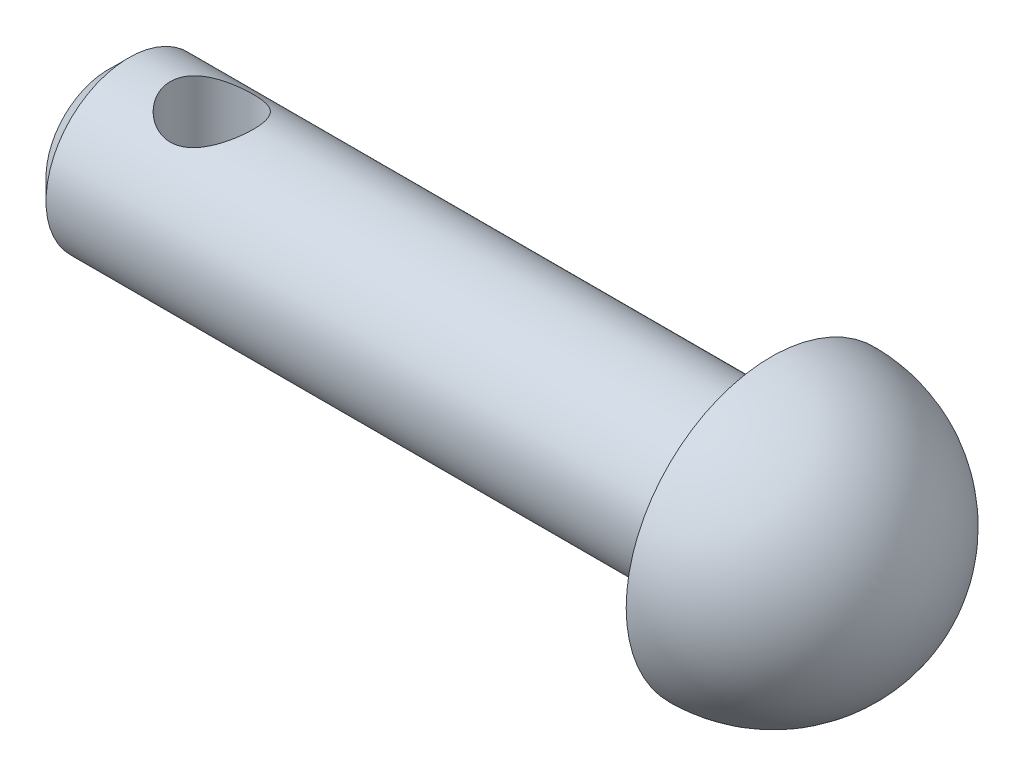
ISO-10303-21;
HEADER;
FILE_DESCRIPTION(('STEP AP214'),'2;1');
FILE_NAME('part.step','',(''),(''),'','','');
FILE_SCHEMA(('AUTOMOTIVE_DESIGN { 1 0 10303 214 1 1 1 1 }'));
ENDSEC;
DATA;
#1=APPLICATION_CONTEXT('core data for automotive mechanical design processes');
#2=APPLICATION_PROTOCOL_DEFINITION('international standard','automotive_design',2000,#1);
#3=PRODUCT_CONTEXT('',#1,'mechanical');
#4=PRODUCT('Part','Part','',(#3));
#5=PRODUCT_RELATED_PRODUCT_CATEGORY('part','',(#4));
#6=PRODUCT_DEFINITION_FORMATION('','',#4);
#7=PRODUCT_DEFINITION_CONTEXT('part definition',#1,'design');
#8=PRODUCT_DEFINITION('design','',#6,#7);
#9=PRODUCT_DEFINITION_SHAPE('','',#8);
#10=(LENGTH_UNIT() NAMED_UNIT(*) SI_UNIT(.MILLI.,.METRE.));
#11=(NAMED_UNIT(*) PLANE_ANGLE_UNIT() SI_UNIT($,.RADIAN.));
#12=(NAMED_UNIT(*) SI_UNIT($,.STERADIAN.) SOLID_ANGLE_UNIT());
#13=UNCERTAINTY_MEASURE_WITH_UNIT(LENGTH_MEASURE(1.E-05),#10,'distance_accuracy_value','');
#14=(GEOMETRIC_REPRESENTATION_CONTEXT(3) GLOBAL_UNCERTAINTY_ASSIGNED_CONTEXT((#13)) GLOBAL_UNIT_ASSIGNED_CONTEXT((#10,
#11,#12)) REPRESENTATION_CONTEXT('',''));
#15=CARTESIAN_POINT('',(0.,0.,0.));
#16=DIRECTION('',(0.,0.,1.));
#17=DIRECTION('',(1.,0.,0.));
#18=AXIS2_PLACEMENT_3D('',#15,#16,#17);
#19=CARTESIAN_POINT('',(-16.,0.,0.));
#20=DIRECTION('',(1.,0.,0.));
#21=DIRECTION('',(0.,0.,-1.));
#22=AXIS2_PLACEMENT_3D('',#19,#20,#21);
#23=CYLINDRICAL_SURFACE('',#22,2.);
#24=CARTESIAN_POINT('',(-15.5,0.,0.));
#25=DIRECTION('',(1.,0.,0.));
#26=DIRECTION('',(0.,0.,-1.));
#27=AXIS2_PLACEMENT_3D('',#24,#25,#26);
#28=CIRCLE('',#27,2.);
#29=CARTESIAN_POINT('',(-15.5,0.,-2.));
#30=VERTEX_POINT('',#29);
#31=EDGE_CURVE('E39',#30,#30,#28,.T.);
#32=ORIENTED_EDGE('',*,*,#31,.T.);
#33=EDGE_LOOP('',(#32));
#34=FACE_BOUND('',#33,.T.);
#35=CARTESIAN_POINT('',(-12.5,-2.,0.));
#36=CARTESIAN_POINT('',(-12.5000033023195,-1.99999713404151,0.0525719629529865));
#37=CARTESIAN_POINT('',(-12.5041700731217,-1.99790491019518,0.105206599698033));
#38=CARTESIAN_POINT('',(-12.5206528803409,-1.98974156037396,0.208920235268425));
#39=CARTESIAN_POINT('',(-12.5329843929976,-1.98366287828984,0.259996086713504));
#40=CARTESIAN_POINT('',(-12.5651938086168,-1.96816279403312,0.358933544880574));
#41=CARTESIAN_POINT('',(-12.585042384248,-1.9587543917752,0.40680680293918));
#42=CARTESIAN_POINT('',(-12.6315706213649,-1.93745776515779,0.498472616806565));
#43=CARTESIAN_POINT('',(-12.6582497442489,-1.9255697363353,0.54226549399005));
#44=CARTESIAN_POINT('',(-12.7195172494853,-1.89956258258057,0.627507817761919));
#45=CARTESIAN_POINT('',(-12.7544864792396,-1.88535199127536,0.668655211122112));
#46=CARTESIAN_POINT('',(-12.830521479247,-1.85659970246744,0.744779444866977));
#47=CARTESIAN_POINT('',(-12.8715918517724,-1.84205776209035,0.779751583106766));
#48=CARTESIAN_POINT('',(-12.9624833495234,-1.81298951197347,0.845252000450278));
#49=CARTESIAN_POINT('',(-13.0127360983459,-1.79855186970132,0.875225335551636));
#50=CARTESIAN_POINT('',(-13.1183673359862,-1.77285978772321,0.926168226890694));
#51=CARTESIAN_POINT('',(-13.1737421287227,-1.7616030760699,0.947144214966333));
#52=CARTESIAN_POINT('',(-13.2846651054219,-1.74457867037809,0.978132442188588));
#53=CARTESIAN_POINT('',(-13.3400044520674,-1.73852271583714,0.988725857080441));
#54=CARTESIAN_POINT('',(-13.4519788377795,-1.73181889948528,1.00042699330885));
#55=CARTESIAN_POINT('',(-13.5086125408712,-1.73116569343288,1.00154408837307));
#56=CARTESIAN_POINT('',(-13.6142860243154,-1.73510930257248,0.994687287172294));
#57=CARTESIAN_POINT('',(-13.6634240312231,-1.73908763662014,0.987784559536821));
#58=CARTESIAN_POINT('',(-13.759721909373,-1.7507622873385,0.966939849056931));
#59=CARTESIAN_POINT('',(-13.8068811453053,-1.75845978831776,0.952995623897651));
#60=CARTESIAN_POINT('',(-13.8992291325657,-1.77687476412741,0.918209780386003));
#61=CARTESIAN_POINT('',(-13.9443463987858,-1.78765840663999,0.897215067115994));
#62=CARTESIAN_POINT('',(-14.03063429259,-1.81103404281404,0.849041687668002));
#63=CARTESIAN_POINT('',(-14.0718031356001,-1.82362684780191,0.821860243812467));
#64=CARTESIAN_POINT('',(-14.1545212527432,-1.85113157903286,0.758066054912788));
#65=CARTESIAN_POINT('',(-14.1954568735762,-1.86613510236746,0.720694458369282));
#66=CARTESIAN_POINT('',(-14.2707354185909,-1.89547623300407,0.639555578741374));
#67=CARTESIAN_POINT('',(-14.3050751920339,-1.90981351958801,0.595785256574286));
#68=CARTESIAN_POINT('',(-14.3676856610297,-1.93701987282964,0.500516505831849));
#69=CARTESIAN_POINT('',(-14.3956004724457,-1.94978984162007,0.44875359159941));
#70=CARTESIAN_POINT('',(-14.442097029043,-1.97157881121242,0.340466215488798));
#71=CARTESIAN_POINT('',(-14.4606861850152,-1.98060078943553,0.283945576265277));
#72=CARTESIAN_POINT('',(-14.4864754037167,-1.99324333741436,0.172766491660702));
#73=CARTESIAN_POINT('',(-14.4944912357468,-1.99724938301312,0.118341530548324));
#74=CARTESIAN_POINT('',(-14.5014647311345,-2.00073013459102,0.00877959994935364));
#75=CARTESIAN_POINT('',(-14.5004266856395,-2.00020698721312,-0.0463570198699015));
#76=CARTESIAN_POINT('',(-14.4897933115812,-1.99491192253441,-0.151232971985994));
#77=CARTESIAN_POINT('',(-14.48086746727,-1.9904724568819,-0.201059408049954));
#78=CARTESIAN_POINT('',(-14.4557619281049,-1.97822171314819,-0.298406892301917));
#79=CARTESIAN_POINT('',(-14.4395814335466,-1.97041006334332,-0.345927685690997));
#80=CARTESIAN_POINT('',(-14.4000015335668,-1.95184251413669,-0.438888608449665));
#81=CARTESIAN_POINT('',(-14.3764089498832,-1.94100881769939,-0.484230397006154));
#82=CARTESIAN_POINT('',(-14.322892464354,-1.91743974317109,-0.570461361698921));
#83=CARTESIAN_POINT('',(-14.2929658654066,-1.90470355565785,-0.611348629775282));
#84=CARTESIAN_POINT('',(-14.2242395746671,-1.87708221337464,-0.691767689290652));
#85=CARTESIAN_POINT('',(-14.1848571315464,-1.86210884848441,-0.730772077824638));
#86=CARTESIAN_POINT('',(-14.1000748487307,-1.83262391603874,-0.801856321113238));
#87=CARTESIAN_POINT('',(-14.0546708811836,-1.81811267381526,-0.83393138569084));
#88=CARTESIAN_POINT('',(-13.9563563457997,-1.79051192226068,-0.891707914497695));
#89=CARTESIAN_POINT('',(-13.9031887337914,-1.77752529663472,-0.917025495878637));
#90=CARTESIAN_POINT('',(-13.7924899323075,-1.75574072368126,-0.958082826013803));
#91=CARTESIAN_POINT('',(-13.7349644734988,-1.74693738240618,-0.97383491588757));
#92=CARTESIAN_POINT('',(-13.6230897771385,-1.73561501008667,-0.993861687449679));
#93=CARTESIAN_POINT('',(-13.568965746571,-1.73257383460491,-0.999092996400864));
#94=CARTESIAN_POINT('',(-13.4605529328293,-1.73165354646175,-1.00068915438079));
#95=CARTESIAN_POINT('',(-13.4062642312606,-1.73377219627553,-0.997057846624398));
#96=CARTESIAN_POINT('',(-13.304516498468,-1.74237862050025,-0.981926125592262));
#97=CARTESIAN_POINT('',(-13.2568995298556,-1.74843094482394,-0.971208314342799));
#98=CARTESIAN_POINT('',(-13.1641918805753,-1.76371016187918,-0.943175358224645));
#99=CARTESIAN_POINT('',(-13.119102017908,-1.77293807569676,-0.92585809115981));
#100=CARTESIAN_POINT('',(-13.0293751490134,-1.79428530364528,-0.883815745300682));
#101=CARTESIAN_POINT('',(-12.9849720981703,-1.80655722396191,-0.858671137816458));
#102=CARTESIAN_POINT('',(-12.9007254638194,-1.8323533163459,-0.802150971636634));
#103=CARTESIAN_POINT('',(-12.8608842694815,-1.84587813794522,-0.770772171238648));
#104=CARTESIAN_POINT('',(-12.7818580176424,-1.87462323159313,-0.698203326664641));
#105=CARTESIAN_POINT('',(-12.7433408976381,-1.88984983311469,-0.656284423010171));
#106=CARTESIAN_POINT('',(-12.6737370165764,-1.91877752255088,-0.566154806220279));
#107=CARTESIAN_POINT('',(-12.6426542605737,-1.9324777860804,-0.517940723256785));
#108=CARTESIAN_POINT('',(-12.5887636372378,-1.95698009585103,-0.415931596819947));
#109=CARTESIAN_POINT('',(-12.5660158305886,-1.96776096562909,-0.362099503934614));
#110=CARTESIAN_POINT('',(-12.530191832081,-1.98501341363465,-0.250742101294191));
#111=CARTESIAN_POINT('',(-12.5170881531704,-1.99149723372932,-0.193227799623166));
#112=CARTESIAN_POINT('',(-12.5061025889242,-1.99695461909663,-0.112601946483383));
#113=CARTESIAN_POINT('',(-12.5038173591364,-1.99809365339202,-0.0901618794394981));
#114=CARTESIAN_POINT('',(-12.5007653344832,-1.99961696977865,-0.0451517318071573));
#115=CARTESIAN_POINT('',(-12.4999985815288,-2.00000123103763,-0.0225816476473812));
#116=CARTESIAN_POINT('',(-12.5,-2.,0.));
#117=B_SPLINE_CURVE_WITH_KNOTS('',3,(#35,#36,#37,#38,#39,#40,#41,#42,#43,#44,#45,#46,#47,#48,
#49,#50,#51,#52,#53,#54,#55,#56,#57,#58,#59,#60,#61,#62,#63,#64,#65,#66,#67,#68,#69,#70,#71,#72,
#73,#74,#75,#76,#77,#78,#79,#80,#81,#82,#83,#84,#85,#86,#87,#88,#89,#90,#91,#92,#93,#94,#95,#96,
#97,#98,#99,#100,#101,#102,#103,#104,#105,#106,#107,#108,#109,#110,#111,#112,#113,#114,#115,
#116),.UNSPECIFIED.,.T.,.F.,(4,2,2,2,2,2,2,2,2,2,2,2,2,2,2,2,2,2,2,2,2,2,2,2,2,2,2,2,2,2,2,2,2,
2,2,2,2,2,2,2,4),(0.,0.157624257420292,0.315548149709197,0.472862155492299,0.630163760581567,
0.796981758718089,0.963926237654035,1.14381726430752,1.32357947898281,1.4925801214023,
1.6614135732902,1.81005712409321,1.95874803925679,2.11090240168487,2.26312521260222,
2.43464941333878,2.60625534598686,2.7858302221444,2.96526216912279,3.12983290471345,
3.29432564511476,3.44606906506122,3.59782921630931,3.75392856027898,3.91009450748339,
4.08159610644418,4.25321588615432,4.43314682159674,4.61284511940777,4.77529307498373,
4.93767059860005,5.08457930244182,5.23153528783678,5.38836456775614,5.54527561138957,
5.72125242752498,5.89732383376572,6.07464013662925,6.2514490862493,6.31915280137697,
6.38685838514846),.UNSPECIFIED.);
#118=CARTESIAN_POINT('',(-12.5,-2.,0.));
#119=VERTEX_POINT('',#118);
#120=EDGE_CURVE('E64',#119,#119,#117,.T.);
#121=ORIENTED_EDGE('',*,*,#120,.F.);
#122=EDGE_LOOP('',(#121));
#123=FACE_BOUND('',#122,.T.);
#124=CARTESIAN_POINT('',(-13.5,1.73205080756888,1.));
#125=CARTESIAN_POINT('',(-13.4478921918048,1.73205534728459,0.999996363074531));
#126=CARTESIAN_POINT('',(-13.395718588475,1.73443801187756,0.995899970733216));
#127=CARTESIAN_POINT('',(-13.2929727353228,1.74362366452052,0.979723209898053));
#128=CARTESIAN_POINT('',(-13.2424040849566,1.75043594055559,0.967626064554179));
#129=CARTESIAN_POINT('',(-13.1445483356561,1.76749346605398,0.936099948699812));
#130=CARTESIAN_POINT('',(-13.0972453475264,1.77772043473252,0.916709952493731));
#131=CARTESIAN_POINT('',(-13.0065757980033,1.80042664816858,0.871267525376372));
#132=CARTESIAN_POINT('',(-12.9632094497375,1.81290601476065,0.845214734035773));
#133=CARTESIAN_POINT('',(-12.8776942714425,1.83996869057441,0.784666540530878));
#134=CARTESIAN_POINT('',(-12.8359408643265,1.85464063637954,0.74965203614377));
#135=CARTESIAN_POINT('',(-12.7585916115933,1.88371982785706,0.673253807614468));
#136=CARTESIAN_POINT('',(-12.7229988374165,1.8981269383125,0.631866925782293));
#137=CARTESIAN_POINT('',(-12.6566328488523,1.92621476952949,0.540489563414546));
#138=CARTESIAN_POINT('',(-12.6263462321405,1.93978106418172,0.490107189012574));
#139=CARTESIAN_POINT('',(-12.5748591467542,1.96350756099529,0.384157026599503));
#140=CARTESIAN_POINT('',(-12.5536529438628,1.97366991183742,0.328592538138155));
#141=CARTESIAN_POINT('',(-12.5224953386989,1.98880461244237,0.218044943925977));
#142=CARTESIAN_POINT('',(-12.5118504736445,1.99409480220892,0.163301790488817));
#143=CARTESIAN_POINT('',(-12.499833881325,2.00007583846067,0.0525706286978483));
#144=CARTESIAN_POINT('',(-12.4984565432043,2.0007694678459,-0.00341660584373823));
#145=CARTESIAN_POINT('',(-12.5047466739703,1.9976298191645,-0.10983252442375));
#146=CARTESIAN_POINT('',(-12.5116380155212,1.9941849589216,-0.160321199176791));
#147=CARTESIAN_POINT('',(-12.5328808439047,1.98374245259747,-0.259313771918322));
#148=CARTESIAN_POINT('',(-12.5472328889762,1.97674454066394,-0.307817521093925));
#149=CARTESIAN_POINT('',(-12.5830825660898,1.95971583287654,-0.402309391569553));
#150=CARTESIAN_POINT('',(-12.6046763131721,1.94964441529199,-0.448253423515177));
#151=CARTESIAN_POINT('',(-12.6542634162015,1.92737645986687,-0.535976801513327));
#152=CARTESIAN_POINT('',(-12.6822590633023,1.91517916157484,-0.577754648838645));
#153=CARTESIAN_POINT('',(-12.746895351533,1.88844394399229,-0.660173660898195));
#154=CARTESIAN_POINT('',(-12.784103028326,1.87379375998175,-0.70033407502936));
#155=CARTESIAN_POINT('',(-12.8645897249302,1.84454340586812,-0.774104370297779));
#156=CARTESIAN_POINT('',(-12.9078733722741,1.82994328265629,-0.80770921157423));
#157=CARTESIAN_POINT('',(-13.0026481924241,1.80144156092485,-0.869505334642211));
#158=CARTESIAN_POINT('',(-13.0544860230542,1.78764319990708,-0.897217314978051));
#159=CARTESIAN_POINT('',(-13.162937671359,1.76375450278576,-0.943319113001231));
#160=CARTESIAN_POINT('',(-13.2195464330176,1.75366030046067,-0.961718658210889));
#161=CARTESIAN_POINT('',(-13.3312145112828,1.73944635817034,-0.98718021102504));
#162=CARTESIAN_POINT('',(-13.3860411190436,1.73491655848496,-0.995025122119975));
#163=CARTESIAN_POINT('',(-13.4964013415165,1.7311791936161,-1.00151694661143));
#164=CARTESIAN_POINT('',(-13.5519344291198,1.73196786889312,-1.00017035731503));
#165=CARTESIAN_POINT('',(-13.6556539185787,1.73834336540585,-0.989036043343966));
#166=CARTESIAN_POINT('',(-13.7039794511079,1.74339587506654,-0.980187816712467));
#167=CARTESIAN_POINT('',(-13.798367786271,1.75694021551341,-0.955696284632441));
#168=CARTESIAN_POINT('',(-13.8444298507466,1.76543316005034,-0.940050778623614));
#169=CARTESIAN_POINT('',(-13.9354113309027,1.78536222079657,-0.901647588604886));
#170=CARTESIAN_POINT('',(-13.9801790168536,1.79691643243063,-0.878594063692724));
#171=CARTESIAN_POINT('',(-14.065469271539,1.8215611949725,-0.826287064015805));
#172=CARTESIAN_POINT('',(-14.1059896435133,1.83465253355148,-0.797030404332217));
#173=CARTESIAN_POINT('',(-14.1869787675235,1.86287998456336,-0.728837167198854));
#174=CARTESIAN_POINT('',(-14.2267971507177,1.87806583154289,-0.689145272314967));
#175=CARTESIAN_POINT('',(-14.2994122379936,1.90734234977892,-0.60340449539829));
#176=CARTESIAN_POINT('',(-14.3322065702305,1.92143265007709,-0.557353474655348));
#177=CARTESIAN_POINT('',(-14.3905737259501,1.94741361690957,-0.458535362558758));
#178=CARTESIAN_POINT('',(-14.4159331182109,1.95923641672029,-0.405623097574114));
#179=CARTESIAN_POINT('',(-14.4571379038574,1.97883354959301,-0.295522364641082));
#180=CARTESIAN_POINT('',(-14.4729916513663,1.98661143676373,-0.238337701392176));
#181=CARTESIAN_POINT('',(-14.4933685641747,1.99667508181883,-0.126979682330416));
#182=CARTESIAN_POINT('',(-14.4987978758761,1.99939927908191,-0.0730114438504563));
#183=CARTESIAN_POINT('',(-14.5008432654544,2.00042130375131,0.0351259859512042));
#184=CARTESIAN_POINT('',(-14.4974624285236,1.9987206806689,0.0892951002950872));
#185=CARTESIAN_POINT('',(-14.4825835932044,1.99133968837923,0.192537992317147));
#186=CARTESIAN_POINT('',(-14.4716351507423,1.9859289466799,0.241712317811264));
#187=CARTESIAN_POINT('',(-14.442673000697,1.97192093663423,0.337445952183618));
#188=CARTESIAN_POINT('',(-14.4246582799065,1.96332321132796,0.384004884955509));
#189=CARTESIAN_POINT('',(-14.381272947834,1.9432593074812,0.475423406244885));
#190=CARTESIAN_POINT('',(-14.3556206767922,1.93168617198799,0.520125142700046));
#191=CARTESIAN_POINT('',(-14.2980420691409,1.90688133141826,0.604774641814024));
#192=CARTESIAN_POINT('',(-14.2661128508843,1.89364886558361,0.644720207414907));
#193=CARTESIAN_POINT('',(-14.1932028609773,1.86528610226628,0.722914004156891));
#194=CARTESIAN_POINT('',(-14.1516375125228,1.85009799011698,0.760597684539272));
#195=CARTESIAN_POINT('',(-14.0625492788702,1.82063076162852,0.828663287394676));
#196=CARTESIAN_POINT('',(-14.0150211791323,1.80635245761865,0.859038750010059));
#197=CARTESIAN_POINT('',(-13.913363353419,1.77999605304916,0.912431079785654));
#198=CARTESIAN_POINT('',(-13.8590724688713,1.7680017425627,0.935185065960938));
#199=CARTESIAN_POINT('',(-13.7466675956602,1.74866156328352,0.970878709506411));
#200=CARTESIAN_POINT('',(-13.6885671110873,1.74130016147702,0.983851191175346));
#201=CARTESIAN_POINT('',(-13.608194644348,1.73529272601791,0.994367007864414));
#202=CARTESIAN_POINT('',(-13.5866321056021,1.73408129005152,0.99647610496385));
#203=CARTESIAN_POINT('',(-13.5433835193178,1.7324593588775,0.999293405089962));
#204=CARTESIAN_POINT('',(-13.5216974636141,1.73204891725109,1.00000151439987));
#205=CARTESIAN_POINT('',(-13.5,1.73205080756888,1.));
#206=B_SPLINE_CURVE_WITH_KNOTS('',3,(#124,#125,#126,#127,#128,#129,#130,#131,#132,#133,#134,
#135,#136,#137,#138,#139,#140,#141,#142,#143,#144,#145,#146,#147,#148,#149,#150,#151,#152,#153,
#154,#155,#156,#157,#158,#159,#160,#161,#162,#163,#164,#165,#166,#167,#168,#169,#170,#171,#172,
#173,#174,#175,#176,#177,#178,#179,#180,#181,#182,#183,#184,#185,#186,#187,#188,#189,#190,#191,
#192,#193,#194,#195,#196,#197,#198,#199,#200,#201,#202,#203,#204,#205),.UNSPECIFIED.,.T.,.F.,(4,
2,2,2,2,2,2,2,2,2,2,2,2,2,2,2,2,2,2,2,2,2,2,2,2,2,2,2,2,2,2,2,2,2,2,2,2,2,2,2,4),(0.,
0.156232122594713,0.312792892824805,0.468528595918886,0.62427272544515,0.792862312498234,
0.961535710843709,1.14157892238764,1.32150826963891,1.48863484967935,1.6556602368604,
1.80816097484538,1.96067312517455,2.11529534731147,2.26997299350272,2.43927191456891,
2.60870048245918,2.78888841729448,2.96888774211705,3.13462290854212,3.30024093188373,
3.44774183424025,3.59529052436063,3.74967296406087,3.90413486220047,4.07806743580613,
4.25205864978202,4.43064181412966,4.60906779808771,4.77112270389487,4.93312086793972,
5.08444424871492,5.23578933512013,5.39360750719472,5.55149830100719,5.72510241850067,
5.89885942845154,6.07810749038605,6.2567513300276,6.32180135185309,6.3868557249454),.UNSPECIFIED.);
#207=CARTESIAN_POINT('',(-13.5,1.73205080756888,1.));
#208=VERTEX_POINT('',#207);
#209=EDGE_CURVE('E55',#208,#208,#206,.T.);
#210=ORIENTED_EDGE('',*,*,#209,.F.);
#211=EDGE_LOOP('',(#210));
#212=FACE_BOUND('',#211,.T.);
#213=CARTESIAN_POINT('',(0.,0.,0.));
#214=DIRECTION('',(1.,0.,0.));
#215=DIRECTION('',(0.,0.,-1.));
#216=AXIS2_PLACEMENT_3D('',#213,#214,#215);
#217=CIRCLE('',#216,2.);
#218=CARTESIAN_POINT('',(0.,0.,-2.));
#219=VERTEX_POINT('',#218);
#220=EDGE_CURVE('E52',#219,#219,#217,.T.);
#221=ORIENTED_EDGE('',*,*,#220,.F.);
#222=EDGE_LOOP('',(#221));
#223=FACE_BOUND('',#222,.T.);
#224=ADVANCED_FACE('F32',(#34,#123,#212,#223),#23,.T.);
#225=CARTESIAN_POINT('',(-16.,0.,0.));
#226=DIRECTION('',(1.,0.,0.));
#227=DIRECTION('',(0.,0.,-1.));
#228=AXIS2_PLACEMENT_3D('',#225,#226,#227);
#229=PLANE('',#228);
#230=CARTESIAN_POINT('',(-16.,0.,0.));
#231=DIRECTION('',(1.,0.,0.));
#232=DIRECTION('',(0.,0.,-1.));
#233=AXIS2_PLACEMENT_3D('',#230,#231,#232);
#234=CIRCLE('',#233,1.5);
#235=CARTESIAN_POINT('',(-16.,0.,-1.5));
#236=VERTEX_POINT('',#235);
#237=EDGE_CURVE('E11',#236,#236,#234,.F.);
#238=ORIENTED_EDGE('',*,*,#237,.T.);
#239=EDGE_LOOP('',(#238));
#240=FACE_BOUND('',#239,.T.);
#241=ADVANCED_FACE('F72',(#240),#229,.F.);
#242=CARTESIAN_POINT('',(-13.5,-2.,0.));
#243=DIRECTION('',(0.,1.,0.));
#244=DIRECTION('',(0.,0.,1.));
#245=AXIS2_PLACEMENT_3D('',#242,#243,#244);
#246=CYLINDRICAL_SURFACE('',#245,1.);
#247=ORIENTED_EDGE('',*,*,#120,.T.);
#248=EDGE_LOOP('',(#247));
#249=FACE_BOUND('',#248,.T.);
#250=ORIENTED_EDGE('',*,*,#209,.T.);
#251=EDGE_LOOP('',(#250));
#252=FACE_BOUND('',#251,.T.);
#253=ADVANCED_FACE('F46',(#249,#252),#246,.F.);
#254=CARTESIAN_POINT('',(0.00138914946284951,0.,-0.0999997319810688));
#255=DIRECTION('',(0.,-1.,0.));
#256=DIRECTION('',(0.,0.,1.));
#257=AXIS2_PLACEMENT_3D('',#254,#255,#256);
#258=CIRCLE('',#257,3.6);
#259=TRIMMED_CURVE('',#258,(PARAMETER_VALUE(-1.54301505000954)),
(PARAMETER_VALUE(1.54301505000954)),.T.,.PARAMETER.);
#260=CARTESIAN_POINT('',(0.00138914946284951,0.,0.));
#261=DIRECTION('',(-1.,0.,0.));
#262=AXIS1_PLACEMENT('',#260,#261);
#263=SURFACE_OF_REVOLUTION('',#259,#262);
#264=CARTESIAN_POINT('',(3.6,0.,0.));
#265=VERTEX_POINT('',#264);
#266=VERTEX_LOOP('',#265);
#267=FACE_BOUND('',#266,.T.);
#268=CARTESIAN_POINT('',(0.,0.,0.));
#269=DIRECTION('',(-1.,0.,0.));
#270=DIRECTION('',(0.,0.,1.));
#271=AXIS2_PLACEMENT_3D('',#268,#269,#270);
#272=CIRCLE('',#271,3.5);
#273=CARTESIAN_POINT('',(0.,0.,3.5));
#274=VERTEX_POINT('',#273);
#275=EDGE_CURVE('E50',#274,#274,#272,.T.);
#276=ORIENTED_EDGE('',*,*,#275,.F.);
#277=EDGE_LOOP('',(#276));
#278=FACE_BOUND('',#277,.T.);
#279=ADVANCED_FACE('F42',(#267,#278),#263,.T.);
#280=CARTESIAN_POINT('',(0.,0.,0.));
#281=DIRECTION('',(-1.,0.,0.));
#282=DIRECTION('',(0.,0.,1.));
#283=AXIS2_PLACEMENT_3D('',#280,#281,#282);
#284=PLANE('',#283);
#285=ORIENTED_EDGE('',*,*,#220,.T.);
#286=EDGE_LOOP('',(#285));
#287=FACE_BOUND('',#286,.T.);
#288=ORIENTED_EDGE('',*,*,#275,.T.);
#289=EDGE_LOOP('',(#288));
#290=FACE_BOUND('',#289,.T.);
#291=ADVANCED_FACE('F45',(#287,#290),#284,.T.);
#292=CARTESIAN_POINT('',(-15.5,0.,0.));
#293=DIRECTION('',(1.,0.,0.));
#294=DIRECTION('',(0.,0.,-1.));
#295=AXIS2_PLACEMENT_3D('',#292,#293,#294);
#296=CONICAL_SURFACE('',#295,2.,0.785398163397452);
#297=ORIENTED_EDGE('',*,*,#237,.F.);
#298=EDGE_LOOP('',(#297));
#299=FACE_BOUND('',#298,.T.);
#300=ORIENTED_EDGE('',*,*,#31,.F.);
#301=EDGE_LOOP('',(#300));
#302=FACE_BOUND('',#301,.T.);
#303=ADVANCED_FACE('F34',(#299,#302),#296,.T.);
#304=CLOSED_SHELL('',(#224,#241,#253,#279,#291,#303));
#305=MANIFOLD_SOLID_BREP('B2',#304);
#306=ADVANCED_BREP_SHAPE_REPRESENTATION('',(#18,#305),#14);
#307=SHAPE_DEFINITION_REPRESENTATION(#9,#306);
ENDSEC;
END-ISO-10303-21;
